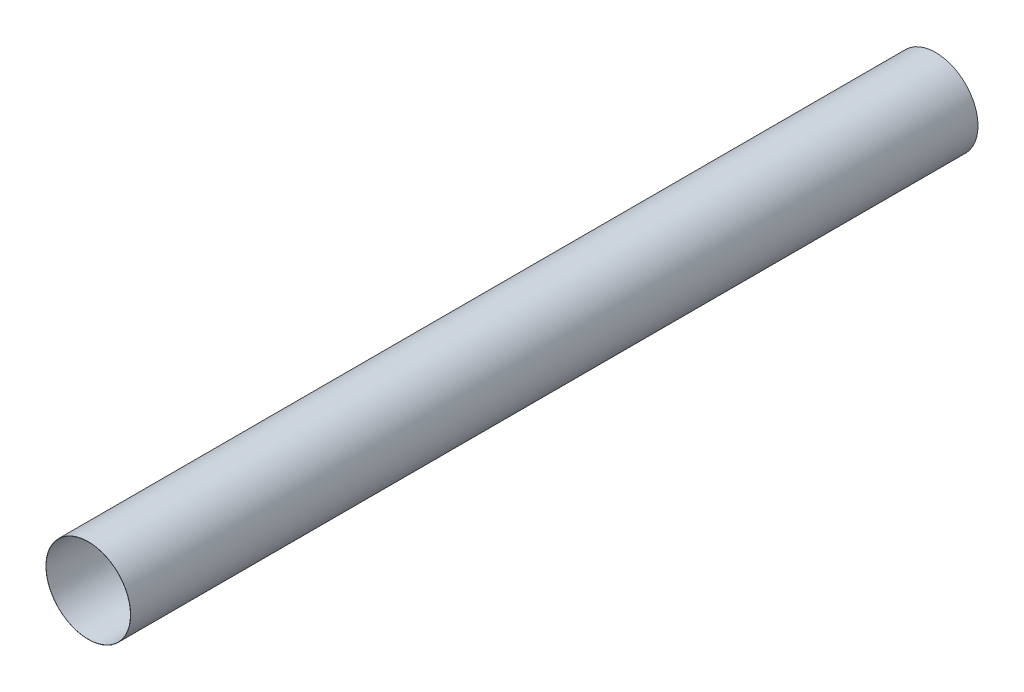
ISO-10303-21;
HEADER;
FILE_DESCRIPTION(('STEP AP214'),'2;1');
FILE_NAME('part.step','',(''),(''),'','','');
FILE_SCHEMA(('AUTOMOTIVE_DESIGN { 1 0 10303 214 1 1 1 1 }'));
ENDSEC;
DATA;
#1=APPLICATION_CONTEXT('core data for automotive mechanical design processes');
#2=APPLICATION_PROTOCOL_DEFINITION('international standard','automotive_design',2000,#1);
#3=PRODUCT_CONTEXT('',#1,'mechanical');
#4=PRODUCT('Part','Part','',(#3));
#5=PRODUCT_RELATED_PRODUCT_CATEGORY('part','',(#4));
#6=PRODUCT_DEFINITION_FORMATION('','',#4);
#7=PRODUCT_DEFINITION_CONTEXT('part definition',#1,'design');
#8=PRODUCT_DEFINITION('design','',#6,#7);
#9=PRODUCT_DEFINITION_SHAPE('','',#8);
#10=(LENGTH_UNIT() NAMED_UNIT(*) SI_UNIT(.MILLI.,.METRE.));
#11=(NAMED_UNIT(*) PLANE_ANGLE_UNIT() SI_UNIT($,.RADIAN.));
#12=(NAMED_UNIT(*) SI_UNIT($,.STERADIAN.) SOLID_ANGLE_UNIT());
#13=UNCERTAINTY_MEASURE_WITH_UNIT(LENGTH_MEASURE(1.E-05),#10,'distance_accuracy_value','');
#14=(GEOMETRIC_REPRESENTATION_CONTEXT(3) GLOBAL_UNCERTAINTY_ASSIGNED_CONTEXT((#13)) GLOBAL_UNIT_ASSIGNED_CONTEXT((#10,
#11,#12)) REPRESENTATION_CONTEXT('',''));
#15=CARTESIAN_POINT('',(0.,0.,0.));
#16=DIRECTION('',(0.,0.,1.));
#17=DIRECTION('',(1.,0.,0.));
#18=AXIS2_PLACEMENT_3D('',#15,#16,#17);
#19=CARTESIAN_POINT('',(0.,0.,10000.));
#20=DIRECTION('',(0.,0.,1.));
#21=DIRECTION('',(1.,0.,0.));
#22=AXIS2_PLACEMENT_3D('',#19,#20,#21);
#23=PLANE('',#22);
#24=CARTESIAN_POINT('',(0.,0.,10000.));
#25=DIRECTION('',(0.,0.,1.));
#26=DIRECTION('',(1.,0.,0.));
#27=AXIS2_PLACEMENT_3D('',#24,#25,#26);
#28=CIRCLE('',#27,500.);
#29=CARTESIAN_POINT('',(500.,0.,10000.));
#30=VERTEX_POINT('',#29);
#31=EDGE_CURVE('E10',#30,#30,#28,.T.);
#32=ORIENTED_EDGE('',*,*,#31,.T.);
#33=EDGE_LOOP('',(#32));
#34=FACE_BOUND('',#33,.T.);
#35=CARTESIAN_POINT('',(0.,0.,10000.));
#36=DIRECTION('',(0.,0.,1.));
#37=DIRECTION('',(1.,0.,0.));
#38=AXIS2_PLACEMENT_3D('',#35,#36,#37);
#39=CIRCLE('',#38,498.);
#40=CARTESIAN_POINT('',(498.,0.,10000.));
#41=VERTEX_POINT('',#40);
#42=EDGE_CURVE('E53',#41,#41,#39,.T.);
#43=ORIENTED_EDGE('',*,*,#42,.F.);
#44=EDGE_LOOP('',(#43));
#45=FACE_BOUND('',#44,.T.);
#46=ADVANCED_FACE('F40',(#34,#45),#23,.T.);
#47=CARTESIAN_POINT('',(0.,0.,0.));
#48=DIRECTION('',(0.,0.,1.));
#49=DIRECTION('',(1.,0.,0.));
#50=AXIS2_PLACEMENT_3D('',#47,#48,#49);
#51=PLANE('',#50);
#52=CARTESIAN_POINT('',(0.,0.,0.));
#53=DIRECTION('',(0.,0.,1.));
#54=DIRECTION('',(1.,0.,0.));
#55=AXIS2_PLACEMENT_3D('',#52,#53,#54);
#56=CIRCLE('',#55,500.);
#57=CARTESIAN_POINT('',(500.,0.,0.));
#58=VERTEX_POINT('',#57);
#59=EDGE_CURVE('E44',#58,#58,#56,.T.);
#60=ORIENTED_EDGE('',*,*,#59,.F.);
#61=EDGE_LOOP('',(#60));
#62=FACE_BOUND('',#61,.T.);
#63=CARTESIAN_POINT('',(0.,0.,0.));
#64=DIRECTION('',(0.,0.,1.));
#65=DIRECTION('',(1.,0.,0.));
#66=AXIS2_PLACEMENT_3D('',#63,#64,#65);
#67=CIRCLE('',#66,498.);
#68=CARTESIAN_POINT('',(498.,0.,0.));
#69=VERTEX_POINT('',#68);
#70=EDGE_CURVE('E55',#69,#69,#67,.T.);
#71=ORIENTED_EDGE('',*,*,#70,.T.);
#72=EDGE_LOOP('',(#71));
#73=FACE_BOUND('',#72,.T.);
#74=ADVANCED_FACE('F67',(#62,#73),#51,.F.);
#75=CARTESIAN_POINT('',(0.,0.,10000.));
#76=DIRECTION('',(0.,0.,-1.));
#77=DIRECTION('',(-1.,0.,0.));
#78=AXIS2_PLACEMENT_3D('',#75,#76,#77);
#79=CYLINDRICAL_SURFACE('',#78,500.);
#80=ORIENTED_EDGE('',*,*,#31,.F.);
#81=EDGE_LOOP('',(#80));
#82=FACE_BOUND('',#81,.T.);
#83=ORIENTED_EDGE('',*,*,#59,.T.);
#84=EDGE_LOOP('',(#83));
#85=FACE_BOUND('',#84,.T.);
#86=ADVANCED_FACE('F42',(#82,#85),#79,.T.);
#87=CARTESIAN_POINT('',(0.,0.,10000.));
#88=DIRECTION('',(0.,0.,-1.));
#89=DIRECTION('',(-1.,0.,0.));
#90=AXIS2_PLACEMENT_3D('',#87,#88,#89);
#91=CYLINDRICAL_SURFACE('',#90,498.);
#92=ORIENTED_EDGE('',*,*,#42,.T.);
#93=EDGE_LOOP('',(#92));
#94=FACE_BOUND('',#93,.T.);
#95=ORIENTED_EDGE('',*,*,#70,.F.);
#96=EDGE_LOOP('',(#95));
#97=FACE_BOUND('',#96,.T.);
#98=ADVANCED_FACE('F63',(#94,#97),#91,.F.);
#99=CLOSED_SHELL('',(#46,#74,#86,#98));
#100=MANIFOLD_SOLID_BREP('B2',#99);
#101=ADVANCED_BREP_SHAPE_REPRESENTATION('',(#18,#100),#14);
#102=SHAPE_DEFINITION_REPRESENTATION(#9,#101);
ENDSEC;
END-ISO-10303-21;
